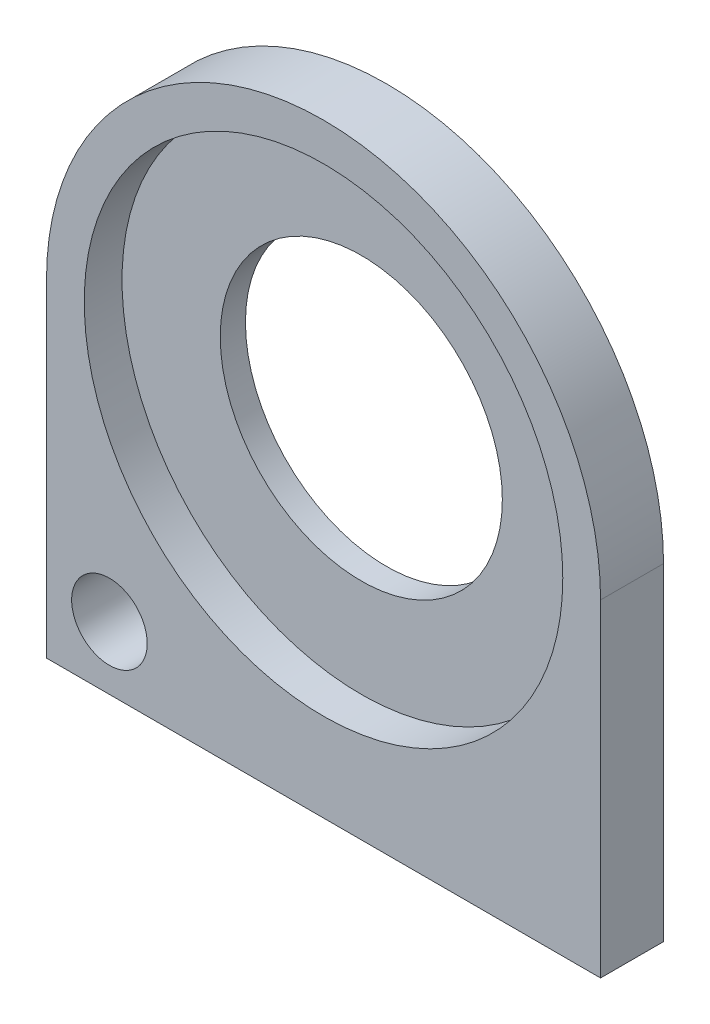
ISO-10303-21;
HEADER;
FILE_DESCRIPTION(('STEP AP214'),'2;1');
FILE_NAME('part.step','',(''),(''),'','','');
FILE_SCHEMA(('AUTOMOTIVE_DESIGN { 1 0 10303 214 1 1 1 1 }'));
ENDSEC;
DATA;
#1=APPLICATION_CONTEXT('core data for automotive mechanical design processes');
#2=APPLICATION_PROTOCOL_DEFINITION('international standard','automotive_design',2000,#1);
#3=PRODUCT_CONTEXT('',#1,'mechanical');
#4=PRODUCT('Part','Part','',(#3));
#5=PRODUCT_RELATED_PRODUCT_CATEGORY('part','',(#4));
#6=PRODUCT_DEFINITION_FORMATION('','',#4);
#7=PRODUCT_DEFINITION_CONTEXT('part definition',#1,'design');
#8=PRODUCT_DEFINITION('design','',#6,#7);
#9=PRODUCT_DEFINITION_SHAPE('','',#8);
#10=(LENGTH_UNIT() NAMED_UNIT(*) SI_UNIT(.MILLI.,.METRE.));
#11=(NAMED_UNIT(*) PLANE_ANGLE_UNIT() SI_UNIT($,.RADIAN.));
#12=(NAMED_UNIT(*) SI_UNIT($,.STERADIAN.) SOLID_ANGLE_UNIT());
#13=UNCERTAINTY_MEASURE_WITH_UNIT(LENGTH_MEASURE(1.E-05),#10,'distance_accuracy_value','');
#14=(GEOMETRIC_REPRESENTATION_CONTEXT(3) GLOBAL_UNCERTAINTY_ASSIGNED_CONTEXT((#13)) GLOBAL_UNIT_ASSIGNED_CONTEXT((#10,
#11,#12)) REPRESENTATION_CONTEXT('',''));
#15=CARTESIAN_POINT('',(0.,0.,0.));
#16=DIRECTION('',(0.,0.,1.));
#17=DIRECTION('',(1.,0.,0.));
#18=AXIS2_PLACEMENT_3D('',#15,#16,#17);
#19=CARTESIAN_POINT('',(-11.,9.45184331797235,2.5));
#20=DIRECTION('',(0.,0.,-1.));
#21=DIRECTION('',(-1.,0.,0.));
#22=AXIS2_PLACEMENT_3D('',#19,#20,#21);
#23=CYLINDRICAL_SURFACE('',#22,5.6);
#24=CARTESIAN_POINT('',(-11.,9.45184331797235,0.));
#25=DIRECTION('',(0.,0.,1.));
#26=DIRECTION('',(1.,0.,0.));
#27=AXIS2_PLACEMENT_3D('',#24,#25,#26);
#28=CIRCLE('',#27,5.6);
#29=CARTESIAN_POINT('',(-5.4,9.45184331797235,0.));
#30=VERTEX_POINT('',#29);
#31=EDGE_CURVE('E103',#30,#30,#28,.T.);
#32=ORIENTED_EDGE('',*,*,#31,.F.);
#33=EDGE_LOOP('',(#32));
#34=FACE_BOUND('',#33,.T.);
#35=CARTESIAN_POINT('',(-11.,9.45184331797235,1.));
#36=DIRECTION('',(0.,0.,1.));
#37=DIRECTION('',(1.,0.,0.));
#38=AXIS2_PLACEMENT_3D('',#35,#36,#37);
#39=CIRCLE('',#38,5.6);
#40=CARTESIAN_POINT('',(-5.4,9.45184331797235,1.));
#41=VERTEX_POINT('',#40);
#42=EDGE_CURVE('E38',#41,#41,#39,.T.);
#43=ORIENTED_EDGE('',*,*,#42,.T.);
#44=EDGE_LOOP('',(#43));
#45=FACE_BOUND('',#44,.T.);
#46=ADVANCED_FACE('F34',(#34,#45),#23,.F.);
#47=CARTESIAN_POINT('',(-11.,9.45184331797235,2.5));
#48=DIRECTION('',(0.,0.,-1.));
#49=DIRECTION('',(-1.,0.,0.));
#50=AXIS2_PLACEMENT_3D('',#47,#48,#49);
#51=PLANE('',#50);
#52=CARTESIAN_POINT('',(-19.5,-1.04815668202765,2.5));
#53=DIRECTION('',(0.,0.,1.));
#54=DIRECTION('',(1.,0.,0.));
#55=AXIS2_PLACEMENT_3D('',#52,#53,#54);
#56=CIRCLE('',#55,1.5);
#57=CARTESIAN_POINT('',(-18.,-1.04815668202765,2.5));
#58=VERTEX_POINT('',#57);
#59=EDGE_CURVE('E124',#58,#58,#56,.T.);
#60=ORIENTED_EDGE('',*,*,#59,.F.);
#61=EDGE_LOOP('',(#60));
#62=FACE_BOUND('',#61,.T.);
#63=CARTESIAN_POINT('',(-11.,9.45184331797235,2.5));
#64=DIRECTION('',(0.,0.,1.));
#65=DIRECTION('',(1.,0.,0.));
#66=AXIS2_PLACEMENT_3D('',#63,#64,#65);
#67=CIRCLE('',#66,9.5);
#68=CARTESIAN_POINT('',(-1.5,9.45184331797235,2.5));
#69=VERTEX_POINT('',#68);
#70=EDGE_CURVE('E117',#69,#69,#67,.T.);
#71=ORIENTED_EDGE('',*,*,#70,.F.);
#72=EDGE_LOOP('',(#71));
#73=FACE_BOUND('',#72,.T.);
#74=CARTESIAN_POINT('',(-11.,9.45184331797235,2.5));
#75=DIRECTION('',(0.,0.,1.));
#76=DIRECTION('',(-1.,0.,0.));
#77=AXIS2_PLACEMENT_3D('',#74,#75,#76);
#78=CIRCLE('',#77,11.);
#79=CARTESIAN_POINT('',(0.,9.45184331797236,2.5));
#80=VERTEX_POINT('',#79);
#81=CARTESIAN_POINT('',(-22.,9.45184331797235,2.5));
#82=VERTEX_POINT('',#81);
#83=EDGE_CURVE('E87',#80,#82,#78,.T.);
#84=ORIENTED_EDGE('',*,*,#83,.T.);
#85=DIRECTION('',(0.,-1.,0.));
#86=VECTOR('',#85,1.);
#87=CARTESIAN_POINT('',(-22.,9.45184331797235,2.5));
#88=LINE('',#87,#86);
#89=CARTESIAN_POINT('',(-22.,-3.54815668202765,2.5));
#90=VERTEX_POINT('',#89);
#91=EDGE_CURVE('E82',#82,#90,#88,.T.);
#92=ORIENTED_EDGE('',*,*,#91,.T.);
#93=DIRECTION('',(1.,0.,0.));
#94=VECTOR('',#93,1.);
#95=CARTESIAN_POINT('',(-22.,-3.54815668202765,2.5));
#96=LINE('',#95,#94);
#97=CARTESIAN_POINT('',(0.,-3.54815668202765,2.5));
#98=VERTEX_POINT('',#97);
#99=EDGE_CURVE('E85',#90,#98,#96,.T.);
#100=ORIENTED_EDGE('',*,*,#99,.T.);
#101=DIRECTION('',(0.,1.,0.));
#102=VECTOR('',#101,1.);
#103=CARTESIAN_POINT('',(0.,-3.54815668202765,2.5));
#104=LINE('',#103,#102);
#105=EDGE_CURVE('E52',#98,#80,#104,.T.);
#106=ORIENTED_EDGE('',*,*,#105,.T.);
#107=EDGE_LOOP('',(#84,#92,#100,#106));
#108=FACE_BOUND('',#107,.T.);
#109=ADVANCED_FACE('F83',(#62,#73,#108),#51,.F.);
#110=CARTESIAN_POINT('',(-11.,9.45184331797235,0.));
#111=DIRECTION('',(0.,0.,-1.));
#112=DIRECTION('',(-1.,0.,0.));
#113=AXIS2_PLACEMENT_3D('',#110,#111,#112);
#114=PLANE('',#113);
#115=CARTESIAN_POINT('',(-19.5,-1.04815668202765,0.));
#116=DIRECTION('',(0.,0.,1.));
#117=DIRECTION('',(1.,0.,0.));
#118=AXIS2_PLACEMENT_3D('',#115,#116,#117);
#119=CIRCLE('',#118,1.5);
#120=CARTESIAN_POINT('',(-18.,-1.04815668202765,0.));
#121=VERTEX_POINT('',#120);
#122=EDGE_CURVE('E121',#121,#121,#119,.T.);
#123=ORIENTED_EDGE('',*,*,#122,.T.);
#124=EDGE_LOOP('',(#123));
#125=FACE_BOUND('',#124,.T.);
#126=CARTESIAN_POINT('',(-11.,9.45184331797235,0.));
#127=DIRECTION('',(0.,0.,1.));
#128=DIRECTION('',(-1.,0.,0.));
#129=AXIS2_PLACEMENT_3D('',#126,#127,#128);
#130=CIRCLE('',#129,11.);
#131=CARTESIAN_POINT('',(0.,9.45184331797236,0.));
#132=VERTEX_POINT('',#131);
#133=CARTESIAN_POINT('',(-22.,9.45184331797235,0.));
#134=VERTEX_POINT('',#133);
#135=EDGE_CURVE('E100',#132,#134,#130,.T.);
#136=ORIENTED_EDGE('',*,*,#135,.F.);
#137=DIRECTION('',(0.,1.,0.));
#138=VECTOR('',#137,1.);
#139=CARTESIAN_POINT('',(0.,-3.54815668202765,0.));
#140=LINE('',#139,#138);
#141=CARTESIAN_POINT('',(0.,-3.54815668202765,0.));
#142=VERTEX_POINT('',#141);
#143=EDGE_CURVE('E75',#142,#132,#140,.T.);
#144=ORIENTED_EDGE('',*,*,#143,.F.);
#145=DIRECTION('',(1.,0.,0.));
#146=VECTOR('',#145,1.);
#147=CARTESIAN_POINT('',(-22.,-3.54815668202765,0.));
#148=LINE('',#147,#146);
#149=CARTESIAN_POINT('',(-22.,-3.54815668202765,0.));
#150=VERTEX_POINT('',#149);
#151=EDGE_CURVE('E69',#150,#142,#148,.T.);
#152=ORIENTED_EDGE('',*,*,#151,.F.);
#153=DIRECTION('',(0.,-1.,0.));
#154=VECTOR('',#153,1.);
#155=CARTESIAN_POINT('',(-22.,9.45184331797235,0.));
#156=LINE('',#155,#154);
#157=EDGE_CURVE('E91',#134,#150,#156,.T.);
#158=ORIENTED_EDGE('',*,*,#157,.F.);
#159=EDGE_LOOP('',(#136,#144,#152,#158));
#160=FACE_BOUND('',#159,.T.);
#161=ORIENTED_EDGE('',*,*,#31,.T.);
#162=EDGE_LOOP('',(#161));
#163=FACE_BOUND('',#162,.T.);
#164=ADVANCED_FACE('F111',(#125,#160,#163),#114,.T.);
#165=CARTESIAN_POINT('',(-11.,9.45184331797235,2.5));
#166=DIRECTION('',(0.,0.,-1.));
#167=DIRECTION('',(-1.,0.,0.));
#168=AXIS2_PLACEMENT_3D('',#165,#166,#167);
#169=CYLINDRICAL_SURFACE('',#168,11.);
#170=ORIENTED_EDGE('',*,*,#135,.T.);
#171=DIRECTION('',(0.,0.,-1.));
#172=VECTOR('',#171,1.);
#173=CARTESIAN_POINT('',(-22.,9.45184331797235,2.5));
#174=LINE('',#173,#172);
#175=EDGE_CURVE('E11',#82,#134,#174,.T.);
#176=ORIENTED_EDGE('',*,*,#175,.F.);
#177=ORIENTED_EDGE('',*,*,#83,.F.);
#178=DIRECTION('',(0.,0.,-1.));
#179=VECTOR('',#178,1.);
#180=CARTESIAN_POINT('',(0.,9.45184331797236,2.5));
#181=LINE('',#180,#179);
#182=EDGE_CURVE('E96',#80,#132,#181,.T.);
#183=ORIENTED_EDGE('',*,*,#182,.T.);
#184=EDGE_LOOP('',(#170,#176,#177,#183));
#185=FACE_BOUND('',#184,.T.);
#186=ADVANCED_FACE('F36',(#185),#169,.T.);
#187=CARTESIAN_POINT('',(-22.,9.45184331797235,2.5));
#188=DIRECTION('',(1.,0.,0.));
#189=DIRECTION('',(0.,1.,0.));
#190=AXIS2_PLACEMENT_3D('',#187,#188,#189);
#191=PLANE('',#190);
#192=ORIENTED_EDGE('',*,*,#157,.T.);
#193=DIRECTION('',(0.,0.,-1.));
#194=VECTOR('',#193,1.);
#195=CARTESIAN_POINT('',(-22.,-3.54815668202765,2.5));
#196=LINE('',#195,#194);
#197=EDGE_CURVE('E44',#90,#150,#196,.T.);
#198=ORIENTED_EDGE('',*,*,#197,.F.);
#199=ORIENTED_EDGE('',*,*,#91,.F.);
#200=ORIENTED_EDGE('',*,*,#175,.T.);
#201=EDGE_LOOP('',(#192,#198,#199,#200));
#202=FACE_BOUND('',#201,.T.);
#203=ADVANCED_FACE('F90',(#202),#191,.F.);
#204=CARTESIAN_POINT('',(-22.,-3.54815668202765,2.5));
#205=DIRECTION('',(0.,1.,0.));
#206=DIRECTION('',(0.,0.,1.));
#207=AXIS2_PLACEMENT_3D('',#204,#205,#206);
#208=PLANE('',#207);
#209=ORIENTED_EDGE('',*,*,#151,.T.);
#210=DIRECTION('',(0.,0.,-1.));
#211=VECTOR('',#210,1.);
#212=CARTESIAN_POINT('',(0.,-3.54815668202765,2.5));
#213=LINE('',#212,#211);
#214=EDGE_CURVE('E92',#98,#142,#213,.T.);
#215=ORIENTED_EDGE('',*,*,#214,.F.);
#216=ORIENTED_EDGE('',*,*,#99,.F.);
#217=ORIENTED_EDGE('',*,*,#197,.T.);
#218=EDGE_LOOP('',(#209,#215,#216,#217));
#219=FACE_BOUND('',#218,.T.);
#220=ADVANCED_FACE('F94',(#219),#208,.F.);
#221=CARTESIAN_POINT('',(0.,-3.54815668202765,2.5));
#222=DIRECTION('',(-1.,0.,0.));
#223=DIRECTION('',(0.,0.,1.));
#224=AXIS2_PLACEMENT_3D('',#221,#222,#223);
#225=PLANE('',#224);
#226=ORIENTED_EDGE('',*,*,#143,.T.);
#227=ORIENTED_EDGE('',*,*,#182,.F.);
#228=ORIENTED_EDGE('',*,*,#105,.F.);
#229=ORIENTED_EDGE('',*,*,#214,.T.);
#230=EDGE_LOOP('',(#226,#227,#228,#229));
#231=FACE_BOUND('',#230,.T.);
#232=ADVANCED_FACE('F108',(#231),#225,.F.);
#233=CARTESIAN_POINT('',(-11.,9.45184331797235,1.));
#234=DIRECTION('',(0.,0.,1.));
#235=DIRECTION('',(1.,0.,0.));
#236=AXIS2_PLACEMENT_3D('',#233,#234,#235);
#237=CYLINDRICAL_SURFACE('',#236,9.5);
#238=CARTESIAN_POINT('',(-11.,9.45184331797235,1.));
#239=DIRECTION('',(0.,0.,1.));
#240=DIRECTION('',(1.,0.,0.));
#241=AXIS2_PLACEMENT_3D('',#238,#239,#240);
#242=CIRCLE('',#241,9.5);
#243=CARTESIAN_POINT('',(-1.5,9.45184331797235,1.));
#244=VERTEX_POINT('',#243);
#245=EDGE_CURVE('E120',#244,#244,#242,.T.);
#246=ORIENTED_EDGE('',*,*,#245,.F.);
#247=EDGE_LOOP('',(#246));
#248=FACE_BOUND('',#247,.T.);
#249=ORIENTED_EDGE('',*,*,#70,.T.);
#250=EDGE_LOOP('',(#249));
#251=FACE_BOUND('',#250,.T.);
#252=ADVANCED_FACE('F143',(#248,#251),#237,.F.);
#253=CARTESIAN_POINT('',(-11.,9.45184331797235,1.));
#254=DIRECTION('',(0.,0.,1.));
#255=DIRECTION('',(1.,0.,0.));
#256=AXIS2_PLACEMENT_3D('',#253,#254,#255);
#257=PLANE('',#256);
#258=ORIENTED_EDGE('',*,*,#42,.F.);
#259=EDGE_LOOP('',(#258));
#260=FACE_BOUND('',#259,.T.);
#261=ORIENTED_EDGE('',*,*,#245,.T.);
#262=EDGE_LOOP('',(#261));
#263=FACE_BOUND('',#262,.T.);
#264=ADVANCED_FACE('F134',(#260,#263),#257,.T.);
#265=CARTESIAN_POINT('',(-19.5,-1.04815668202765,0.));
#266=DIRECTION('',(0.,0.,1.));
#267=DIRECTION('',(1.,0.,0.));
#268=AXIS2_PLACEMENT_3D('',#265,#266,#267);
#269=CYLINDRICAL_SURFACE('',#268,1.5);
#270=ORIENTED_EDGE('',*,*,#122,.F.);
#271=EDGE_LOOP('',(#270));
#272=FACE_BOUND('',#271,.T.);
#273=ORIENTED_EDGE('',*,*,#59,.T.);
#274=EDGE_LOOP('',(#273));
#275=FACE_BOUND('',#274,.T.);
#276=ADVANCED_FACE('F131',(#272,#275),#269,.F.);
#277=CLOSED_SHELL('',(#46,#109,#164,#186,#203,#220,#232,#252,#264,#276));
#278=MANIFOLD_SOLID_BREP('B2',#277);
#279=ADVANCED_BREP_SHAPE_REPRESENTATION('',(#18,#278),#14);
#280=SHAPE_DEFINITION_REPRESENTATION(#9,#279);
ENDSEC;
END-ISO-10303-21;
